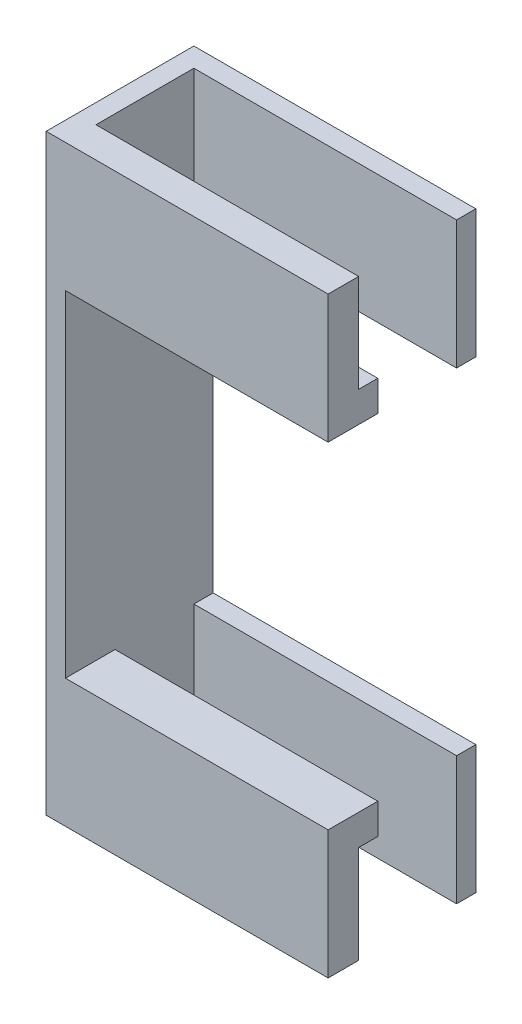
ISO-10303-21;
HEADER;
FILE_DESCRIPTION(('STEP AP214'),'2;1');
FILE_NAME('part.step','',(''),(''),'','','');
FILE_SCHEMA(('AUTOMOTIVE_DESIGN { 1 0 10303 214 1 1 1 1 }'));
ENDSEC;
DATA;
#1=APPLICATION_CONTEXT('core data for automotive mechanical design processes');
#2=APPLICATION_PROTOCOL_DEFINITION('international standard','automotive_design',2000,#1);
#3=PRODUCT_CONTEXT('',#1,'mechanical');
#4=PRODUCT('Part','Part','',(#3));
#5=PRODUCT_RELATED_PRODUCT_CATEGORY('part','',(#4));
#6=PRODUCT_DEFINITION_FORMATION('','',#4);
#7=PRODUCT_DEFINITION_CONTEXT('part definition',#1,'design');
#8=PRODUCT_DEFINITION('design','',#6,#7);
#9=PRODUCT_DEFINITION_SHAPE('','',#8);
#10=(LENGTH_UNIT() NAMED_UNIT(*) SI_UNIT(.MILLI.,.METRE.));
#11=(NAMED_UNIT(*) PLANE_ANGLE_UNIT() SI_UNIT($,.RADIAN.));
#12=(NAMED_UNIT(*) SI_UNIT($,.STERADIAN.) SOLID_ANGLE_UNIT());
#13=UNCERTAINTY_MEASURE_WITH_UNIT(LENGTH_MEASURE(1.E-05),#10,'distance_accuracy_value','');
#14=(GEOMETRIC_REPRESENTATION_CONTEXT(3) GLOBAL_UNCERTAINTY_ASSIGNED_CONTEXT((#13)) GLOBAL_UNIT_ASSIGNED_CONTEXT((#10,
#11,#12)) REPRESENTATION_CONTEXT('',''));
#15=CARTESIAN_POINT('',(0.,0.,0.));
#16=DIRECTION('',(0.,0.,1.));
#17=DIRECTION('',(1.,0.,0.));
#18=AXIS2_PLACEMENT_3D('',#15,#16,#17);
#19=CARTESIAN_POINT('',(0.,0.,-0.1397));
#20=DIRECTION('',(0.,0.,-1.));
#21=DIRECTION('',(-1.,0.,0.));
#22=AXIS2_PLACEMENT_3D('',#19,#20,#21);
#23=PLANE('',#22);
#24=DIRECTION('',(0.,-1.,0.));
#25=VECTOR('',#24,1.);
#26=CARTESIAN_POINT('',(21.844,19.8501,-0.1397));
#27=LINE('',#26,#25);
#28=CARTESIAN_POINT('',(21.844,-13.9573,-0.1397));
#29=VERTEX_POINT('',#28);
#30=CARTESIAN_POINT('',(21.844,-24.6253,-0.1397));
#31=VERTEX_POINT('',#30);
#32=EDGE_CURVE('E218',#29,#31,#27,.T.);
#33=ORIENTED_EDGE('',*,*,#32,.F.);
#34=DIRECTION('',(1.,0.,0.));
#35=VECTOR('',#34,1.);
#36=CARTESIAN_POINT('',(21.844,-13.9573,-0.1397));
#37=LINE('',#36,#35);
#38=CARTESIAN_POINT('',(0.,-13.9573,-0.1397));
#39=VERTEX_POINT('',#38);
#40=EDGE_CURVE('E162',#39,#29,#37,.T.);
#41=ORIENTED_EDGE('',*,*,#40,.F.);
#42=DIRECTION('',(0.,-1.,0.));
#43=VECTOR('',#42,1.);
#44=CARTESIAN_POINT('',(0.,19.8501,-0.1397));
#45=LINE('',#44,#43);
#46=CARTESIAN_POINT('',(0.,-24.6253,-0.1397));
#47=VERTEX_POINT('',#46);
#48=EDGE_CURVE('E224',#39,#47,#45,.T.);
#49=ORIENTED_EDGE('',*,*,#48,.T.);
#50=DIRECTION('',(1.,0.,0.));
#51=VECTOR('',#50,1.);
#52=CARTESIAN_POINT('',(0.,-24.6253,-0.1397));
#53=LINE('',#52,#51);
#54=EDGE_CURVE('E186',#47,#31,#53,.T.);
#55=ORIENTED_EDGE('',*,*,#54,.T.);
#56=EDGE_LOOP('',(#33,#41,#49,#55));
#57=FACE_BOUND('',#56,.T.);
#58=ADVANCED_FACE('F33',(#57),#23,.F.);
#59=CARTESIAN_POINT('',(21.844,19.8501,-1.7399));
#60=DIRECTION('',(-1.,0.,0.));
#61=DIRECTION('',(0.,0.,1.));
#62=AXIS2_PLACEMENT_3D('',#59,#60,#61);
#63=PLANE('',#62);
#64=DIRECTION('',(0.,-1.,0.));
#65=VECTOR('',#64,1.);
#66=CARTESIAN_POINT('',(21.844,19.8501,-1.7399));
#67=LINE('',#66,#65);
#68=CARTESIAN_POINT('',(21.844,-13.9573,-1.7399));
#69=VERTEX_POINT('',#68);
#70=CARTESIAN_POINT('',(21.844,-24.6253,-1.7399));
#71=VERTEX_POINT('',#70);
#72=EDGE_CURVE('E221',#69,#71,#67,.T.);
#73=ORIENTED_EDGE('',*,*,#72,.F.);
#74=DIRECTION('',(0.,0.,1.));
#75=VECTOR('',#74,1.);
#76=CARTESIAN_POINT('',(21.844,-13.9573,-6.4897));
#77=LINE('',#76,#75);
#78=EDGE_CURVE('E174',#69,#29,#77,.T.);
#79=ORIENTED_EDGE('',*,*,#78,.T.);
#80=ORIENTED_EDGE('',*,*,#32,.T.);
#81=DIRECTION('',(0.,0.,-1.));
#82=VECTOR('',#81,1.);
#83=CARTESIAN_POINT('',(21.844,-24.6253,-0.1397));
#84=LINE('',#83,#82);
#85=EDGE_CURVE('E183',#31,#71,#84,.T.);
#86=ORIENTED_EDGE('',*,*,#85,.T.);
#87=EDGE_LOOP('',(#73,#79,#80,#86));
#88=FACE_BOUND('',#87,.T.);
#89=ADVANCED_FACE('F369',(#88),#63,.F.);
#90=CARTESIAN_POINT('',(21.844,16.4973,6.4135));
#91=DIRECTION('',(0.,0.,1.));
#92=DIRECTION('',(1.,0.,0.));
#93=AXIS2_PLACEMENT_3D('',#90,#91,#92);
#94=PLANE('',#93);
#95=DIRECTION('',(0.,-1.,0.));
#96=VECTOR('',#95,1.);
#97=CARTESIAN_POINT('',(0.,19.8501,6.4135));
#98=LINE('',#97,#96);
#99=CARTESIAN_POINT('',(0.,16.4973,6.4135));
#100=VERTEX_POINT('',#99);
#101=CARTESIAN_POINT('',(0.,13.9573,6.4135));
#102=VERTEX_POINT('',#101);
#103=EDGE_CURVE('E127',#100,#102,#98,.T.);
#104=ORIENTED_EDGE('',*,*,#103,.F.);
#105=DIRECTION('',(-1.,0.,0.));
#106=VECTOR('',#105,1.);
#107=CARTESIAN_POINT('',(21.844,16.4973,6.4135));
#108=LINE('',#107,#106);
#109=CARTESIAN_POINT('',(21.844,16.4973,6.4135));
#110=VERTEX_POINT('',#109);
#111=EDGE_CURVE('E105',#110,#100,#108,.T.);
#112=ORIENTED_EDGE('',*,*,#111,.F.);
#113=DIRECTION('',(0.,1.,0.));
#114=VECTOR('',#113,1.);
#115=CARTESIAN_POINT('',(21.844,16.4973,6.4135));
#116=LINE('',#115,#114);
#117=CARTESIAN_POINT('',(21.844,13.9573,6.4135));
#118=VERTEX_POINT('',#117);
#119=EDGE_CURVE('E92',#118,#110,#116,.T.);
#120=ORIENTED_EDGE('',*,*,#119,.F.);
#121=DIRECTION('',(-1.,0.,0.));
#122=VECTOR('',#121,1.);
#123=CARTESIAN_POINT('',(21.844,13.9573,6.4135));
#124=LINE('',#123,#122);
#125=EDGE_CURVE('E99',#118,#102,#124,.T.);
#126=ORIENTED_EDGE('',*,*,#125,.T.);
#127=EDGE_LOOP('',(#104,#112,#120,#126));
#128=FACE_BOUND('',#127,.T.);
#129=ADVANCED_FACE('F107',(#128),#94,.F.);
#130=CARTESIAN_POINT('',(0.,-13.9573,6.4135));
#131=VERTEX_POINT('',#130);
#132=CARTESIAN_POINT('',(0.,-16.4973,6.4135));
#133=VERTEX_POINT('',#132);
#134=EDGE_CURVE('E125',#131,#133,#98,.T.);
#135=ORIENTED_EDGE('',*,*,#134,.F.);
#136=DIRECTION('',(-1.,0.,0.));
#137=VECTOR('',#136,1.);
#138=CARTESIAN_POINT('',(21.844,-13.9573,6.4135));
#139=LINE('',#138,#137);
#140=CARTESIAN_POINT('',(21.844,-13.9573,6.4135));
#141=VERTEX_POINT('',#140);
#142=EDGE_CURVE('E257',#141,#131,#139,.T.);
#143=ORIENTED_EDGE('',*,*,#142,.F.);
#144=DIRECTION('',(0.,1.,0.));
#145=VECTOR('',#144,1.);
#146=CARTESIAN_POINT('',(21.844,-16.4973,6.4135));
#147=LINE('',#146,#145);
#148=CARTESIAN_POINT('',(21.844,-16.4973,6.4135));
#149=VERTEX_POINT('',#148);
#150=EDGE_CURVE('E238',#149,#141,#147,.T.);
#151=ORIENTED_EDGE('',*,*,#150,.F.);
#152=DIRECTION('',(-1.,0.,0.));
#153=VECTOR('',#152,1.);
#154=CARTESIAN_POINT('',(21.844,-16.4973,6.4135));
#155=LINE('',#154,#153);
#156=EDGE_CURVE('E260',#149,#133,#155,.T.);
#157=ORIENTED_EDGE('',*,*,#156,.T.);
#158=EDGE_LOOP('',(#135,#143,#151,#157));
#159=FACE_BOUND('',#158,.T.);
#160=ADVANCED_FACE('F445',(#159),#94,.F.);
#161=CARTESIAN_POINT('',(21.844,19.8501,10.541));
#162=DIRECTION('',(0.,0.,-1.));
#163=DIRECTION('',(-1.,0.,0.));
#164=AXIS2_PLACEMENT_3D('',#161,#162,#163);
#165=PLANE('',#164);
#166=DIRECTION('',(0.,-1.,0.));
#167=VECTOR('',#166,1.);
#168=CARTESIAN_POINT('',(21.844,19.8501,10.541));
#169=LINE('',#168,#167);
#170=CARTESIAN_POINT('',(21.844,24.6253,10.541));
#171=VERTEX_POINT('',#170);
#172=CARTESIAN_POINT('',(21.844,13.9573,10.541));
#173=VERTEX_POINT('',#172);
#174=EDGE_CURVE('E96',#171,#173,#169,.T.);
#175=ORIENTED_EDGE('',*,*,#174,.F.);
#176=DIRECTION('',(1.,0.,0.));
#177=VECTOR('',#176,1.);
#178=CARTESIAN_POINT('',(-1.6002,24.6253,10.541));
#179=LINE('',#178,#177);
#180=CARTESIAN_POINT('',(-1.6002,24.6253,10.541));
#181=VERTEX_POINT('',#180);
#182=EDGE_CURVE('E215',#181,#171,#179,.T.);
#183=ORIENTED_EDGE('',*,*,#182,.F.);
#184=DIRECTION('',(0.,1.,0.));
#185=VECTOR('',#184,1.);
#186=CARTESIAN_POINT('',(-1.6002,19.8501,10.541));
#187=LINE('',#186,#185);
#188=CARTESIAN_POINT('',(-1.6002,-24.6253,10.541));
#189=VERTEX_POINT('',#188);
#190=EDGE_CURVE('E118',#189,#181,#187,.T.);
#191=ORIENTED_EDGE('',*,*,#190,.F.);
#192=DIRECTION('',(1.,0.,0.));
#193=VECTOR('',#192,1.);
#194=CARTESIAN_POINT('',(-1.6002,-24.6253,10.541));
#195=LINE('',#194,#193);
#196=CARTESIAN_POINT('',(21.844,-24.6253,10.541));
#197=VERTEX_POINT('',#196);
#198=EDGE_CURVE('E173',#189,#197,#195,.T.);
#199=ORIENTED_EDGE('',*,*,#198,.T.);
#200=DIRECTION('',(0.,-1.,0.));
#201=VECTOR('',#200,1.);
#202=CARTESIAN_POINT('',(21.844,-19.8501,10.541));
#203=LINE('',#202,#201);
#204=CARTESIAN_POINT('',(21.844,-13.9573,10.541));
#205=VERTEX_POINT('',#204);
#206=EDGE_CURVE('E244',#205,#197,#203,.T.);
#207=ORIENTED_EDGE('',*,*,#206,.F.);
#208=DIRECTION('',(-1.,0.,0.));
#209=VECTOR('',#208,1.);
#210=CARTESIAN_POINT('',(21.844,-13.9573,10.541));
#211=LINE('',#210,#209);
#212=CARTESIAN_POINT('',(0.,-13.9573,10.541));
#213=VERTEX_POINT('',#212);
#214=EDGE_CURVE('E247',#205,#213,#211,.T.);
#215=ORIENTED_EDGE('',*,*,#214,.T.);
#216=DIRECTION('',(0.,1.,0.));
#217=VECTOR('',#216,1.);
#218=CARTESIAN_POINT('',(0.,19.8501,10.541));
#219=LINE('',#218,#217);
#220=CARTESIAN_POINT('',(0.,13.9573,10.541));
#221=VERTEX_POINT('',#220);
#222=EDGE_CURVE('E266',#213,#221,#219,.T.);
#223=ORIENTED_EDGE('',*,*,#222,.T.);
#224=DIRECTION('',(-1.,0.,0.));
#225=VECTOR('',#224,1.);
#226=CARTESIAN_POINT('',(21.844,13.9573,10.541));
#227=LINE('',#226,#225);
#228=EDGE_CURVE('E104',#173,#221,#227,.T.);
#229=ORIENTED_EDGE('',*,*,#228,.F.);
#230=EDGE_LOOP('',(#175,#183,#191,#199,#207,#215,#223,#229));
#231=FACE_BOUND('',#230,.T.);
#232=ADVANCED_FACE('F35',(#231),#165,.F.);
#233=CARTESIAN_POINT('',(21.844,13.9573,10.541));
#234=DIRECTION('',(0.,1.,0.));
#235=DIRECTION('',(0.,0.,1.));
#236=AXIS2_PLACEMENT_3D('',#233,#234,#235);
#237=PLANE('',#236);
#238=DIRECTION('',(0.,0.,-1.));
#239=VECTOR('',#238,1.);
#240=CARTESIAN_POINT('',(0.,13.9573,10.541));
#241=LINE('',#240,#239);
#242=EDGE_CURVE('E70',#221,#102,#241,.T.);
#243=ORIENTED_EDGE('',*,*,#242,.T.);
#244=ORIENTED_EDGE('',*,*,#125,.F.);
#245=DIRECTION('',(0.,0.,-1.));
#246=VECTOR('',#245,1.);
#247=CARTESIAN_POINT('',(21.844,13.9573,10.541));
#248=LINE('',#247,#246);
#249=EDGE_CURVE('E89',#173,#118,#248,.T.);
#250=ORIENTED_EDGE('',*,*,#249,.F.);
#251=ORIENTED_EDGE('',*,*,#228,.T.);
#252=EDGE_LOOP('',(#243,#244,#250,#251));
#253=FACE_BOUND('',#252,.T.);
#254=ADVANCED_FACE('F100',(#253),#237,.F.);
#255=CARTESIAN_POINT('',(21.844,16.4973,8.001));
#256=DIRECTION('',(0.,-1.,0.));
#257=DIRECTION('',(0.,0.,-1.));
#258=AXIS2_PLACEMENT_3D('',#255,#256,#257);
#259=PLANE('',#258);
#260=DIRECTION('',(0.,0.,1.));
#261=VECTOR('',#260,1.);
#262=CARTESIAN_POINT('',(0.,16.4973,8.001));
#263=LINE('',#262,#261);
#264=CARTESIAN_POINT('',(0.,16.4973,8.001));
#265=VERTEX_POINT('',#264);
#266=EDGE_CURVE('E117',#100,#265,#263,.T.);
#267=ORIENTED_EDGE('',*,*,#266,.T.);
#268=DIRECTION('',(-1.,0.,0.));
#269=VECTOR('',#268,1.);
#270=CARTESIAN_POINT('',(21.844,16.4973,8.001));
#271=LINE('',#270,#269);
#272=CARTESIAN_POINT('',(21.844,16.4973,8.001));
#273=VERTEX_POINT('',#272);
#274=EDGE_CURVE('E115',#273,#265,#271,.T.);
#275=ORIENTED_EDGE('',*,*,#274,.F.);
#276=DIRECTION('',(0.,0.,1.));
#277=VECTOR('',#276,1.);
#278=CARTESIAN_POINT('',(21.844,16.4973,8.001));
#279=LINE('',#278,#277);
#280=EDGE_CURVE('E57',#110,#273,#279,.T.);
#281=ORIENTED_EDGE('',*,*,#280,.F.);
#282=ORIENTED_EDGE('',*,*,#111,.T.);
#283=EDGE_LOOP('',(#267,#275,#281,#282));
#284=FACE_BOUND('',#283,.T.);
#285=ADVANCED_FACE('F380',(#284),#259,.F.);
#286=CARTESIAN_POINT('',(21.844,19.8501,8.001));
#287=DIRECTION('',(0.,0.,1.));
#288=DIRECTION('',(1.,0.,0.));
#289=AXIS2_PLACEMENT_3D('',#286,#287,#288);
#290=PLANE('',#289);
#291=DIRECTION('',(0.,1.,0.));
#292=VECTOR('',#291,1.);
#293=CARTESIAN_POINT('',(0.,19.8501,8.001));
#294=LINE('',#293,#292);
#295=CARTESIAN_POINT('',(0.,24.6253,8.001));
#296=VERTEX_POINT('',#295);
#297=EDGE_CURVE('E81',#265,#296,#294,.T.);
#298=ORIENTED_EDGE('',*,*,#297,.T.);
#299=DIRECTION('',(-1.,0.,0.));
#300=VECTOR('',#299,1.);
#301=CARTESIAN_POINT('',(21.844,24.6253,8.001));
#302=LINE('',#301,#300);
#303=CARTESIAN_POINT('',(21.844,24.6253,8.001));
#304=VERTEX_POINT('',#303);
#305=EDGE_CURVE('E198',#304,#296,#302,.T.);
#306=ORIENTED_EDGE('',*,*,#305,.F.);
#307=DIRECTION('',(0.,1.,0.));
#308=VECTOR('',#307,1.);
#309=CARTESIAN_POINT('',(21.844,19.8501,8.001));
#310=LINE('',#309,#308);
#311=EDGE_CURVE('E110',#273,#304,#310,.T.);
#312=ORIENTED_EDGE('',*,*,#311,.F.);
#313=ORIENTED_EDGE('',*,*,#274,.T.);
#314=EDGE_LOOP('',(#298,#306,#312,#313));
#315=FACE_BOUND('',#314,.T.);
#316=ADVANCED_FACE('F378',(#315),#290,.F.);
#317=CARTESIAN_POINT('',(21.844,0.,0.));
#318=DIRECTION('',(-1.,0.,0.));
#319=DIRECTION('',(0.,0.,1.));
#320=AXIS2_PLACEMENT_3D('',#317,#318,#319);
#321=PLANE('',#320);
#322=ORIENTED_EDGE('',*,*,#311,.T.);
#323=DIRECTION('',(0.,0.,-1.));
#324=VECTOR('',#323,1.);
#325=CARTESIAN_POINT('',(21.844,24.6253,10.541));
#326=LINE('',#325,#324);
#327=EDGE_CURVE('E195',#171,#304,#326,.T.);
#328=ORIENTED_EDGE('',*,*,#327,.F.);
#329=ORIENTED_EDGE('',*,*,#174,.T.);
#330=ORIENTED_EDGE('',*,*,#249,.T.);
#331=ORIENTED_EDGE('',*,*,#119,.T.);
#332=ORIENTED_EDGE('',*,*,#280,.T.);
#333=EDGE_LOOP('',(#322,#328,#329,#330,#331,#332));
#334=FACE_BOUND('',#333,.T.);
#335=ADVANCED_FACE('F90',(#334),#321,.F.);
#336=CARTESIAN_POINT('',(0.,0.,0.));
#337=DIRECTION('',(-1.,0.,0.));
#338=DIRECTION('',(0.,0.,1.));
#339=AXIS2_PLACEMENT_3D('',#336,#337,#338);
#340=PLANE('',#339);
#341=ORIENTED_EDGE('',*,*,#297,.F.);
#342=ORIENTED_EDGE('',*,*,#266,.F.);
#343=ORIENTED_EDGE('',*,*,#103,.T.);
#344=ORIENTED_EDGE('',*,*,#242,.F.);
#345=ORIENTED_EDGE('',*,*,#222,.F.);
#346=DIRECTION('',(0.,0.,1.));
#347=VECTOR('',#346,1.);
#348=CARTESIAN_POINT('',(0.,-13.9573,10.541));
#349=LINE('',#348,#347);
#350=EDGE_CURVE('E235',#131,#213,#349,.T.);
#351=ORIENTED_EDGE('',*,*,#350,.F.);
#352=ORIENTED_EDGE('',*,*,#134,.T.);
#353=DIRECTION('',(0.,0.,-1.));
#354=VECTOR('',#353,1.);
#355=CARTESIAN_POINT('',(0.,-16.4973,8.001));
#356=LINE('',#355,#354);
#357=CARTESIAN_POINT('',(0.,-16.4973,8.001));
#358=VERTEX_POINT('',#357);
#359=EDGE_CURVE('E250',#358,#133,#356,.T.);
#360=ORIENTED_EDGE('',*,*,#359,.F.);
#361=DIRECTION('',(0.,1.,0.));
#362=VECTOR('',#361,1.);
#363=CARTESIAN_POINT('',(0.,-19.8501,8.001));
#364=LINE('',#363,#362);
#365=CARTESIAN_POINT('',(0.,-24.6253,8.001));
#366=VERTEX_POINT('',#365);
#367=EDGE_CURVE('E229',#366,#358,#364,.T.);
#368=ORIENTED_EDGE('',*,*,#367,.F.);
#369=DIRECTION('',(0.,0.,-1.));
#370=VECTOR('',#369,1.);
#371=CARTESIAN_POINT('',(0.,-24.6253,8.001));
#372=LINE('',#371,#370);
#373=EDGE_CURVE('E189',#366,#47,#372,.T.);
#374=ORIENTED_EDGE('',*,*,#373,.T.);
#375=ORIENTED_EDGE('',*,*,#48,.F.);
#376=DIRECTION('',(0.,0.,1.));
#377=VECTOR('',#376,1.);
#378=CARTESIAN_POINT('',(0.,-13.9573,-6.4897));
#379=LINE('',#378,#377);
#380=CARTESIAN_POINT('',(0.,-13.9573,-1.7399));
#381=VERTEX_POINT('',#380);
#382=EDGE_CURVE('E137',#381,#39,#379,.T.);
#383=ORIENTED_EDGE('',*,*,#382,.F.);
#384=DIRECTION('',(0.,1.,0.));
#385=VECTOR('',#384,1.);
#386=CARTESIAN_POINT('',(0.,0.,-1.7399));
#387=LINE('',#386,#385);
#388=CARTESIAN_POINT('',(0.,13.9573,-1.7399));
#389=VERTEX_POINT('',#388);
#390=EDGE_CURVE('E41',#381,#389,#387,.T.);
#391=ORIENTED_EDGE('',*,*,#390,.T.);
#392=DIRECTION('',(0.,0.,1.));
#393=VECTOR('',#392,1.);
#394=CARTESIAN_POINT('',(0.,13.9573,-6.4897));
#395=LINE('',#394,#393);
#396=CARTESIAN_POINT('',(0.,13.9573,-0.1397));
#397=VERTEX_POINT('',#396);
#398=EDGE_CURVE('E48',#389,#397,#395,.T.);
#399=ORIENTED_EDGE('',*,*,#398,.T.);
#400=CARTESIAN_POINT('',(0.,24.6253,-0.1397));
#401=VERTEX_POINT('',#400);
#402=EDGE_CURVE('E226',#401,#397,#45,.T.);
#403=ORIENTED_EDGE('',*,*,#402,.F.);
#404=DIRECTION('',(0.,0.,-1.));
#405=VECTOR('',#404,1.);
#406=CARTESIAN_POINT('',(0.,24.6253,8.001));
#407=LINE('',#406,#405);
#408=EDGE_CURVE('E201',#296,#401,#407,.T.);
#409=ORIENTED_EDGE('',*,*,#408,.F.);
#410=EDGE_LOOP('',(#341,#342,#343,#344,#345,#351,#352,#360,#368,#374,#375,#383,#391,#399,#403,#409));
#411=FACE_BOUND('',#410,.T.);
#412=ADVANCED_FACE('F131',(#411),#340,.F.);
#413=CARTESIAN_POINT('',(-1.6002,0.,0.));
#414=DIRECTION('',(-1.,0.,0.));
#415=DIRECTION('',(0.,0.,1.));
#416=AXIS2_PLACEMENT_3D('',#413,#414,#415);
#417=PLANE('',#416);
#418=ORIENTED_EDGE('',*,*,#190,.T.);
#419=DIRECTION('',(0.,0.,1.));
#420=VECTOR('',#419,1.);
#421=CARTESIAN_POINT('',(-1.6002,24.6253,-1.7399));
#422=LINE('',#421,#420);
#423=CARTESIAN_POINT('',(-1.6002,24.6253,-1.7399));
#424=VERTEX_POINT('',#423);
#425=EDGE_CURVE('E212',#424,#181,#422,.T.);
#426=ORIENTED_EDGE('',*,*,#425,.F.);
#427=DIRECTION('',(0.,1.,0.));
#428=VECTOR('',#427,1.);
#429=CARTESIAN_POINT('',(-1.6002,19.8501,-1.7399));
#430=LINE('',#429,#428);
#431=CARTESIAN_POINT('',(-1.6002,-24.6253,-1.7399));
#432=VERTEX_POINT('',#431);
#433=EDGE_CURVE('E220',#432,#424,#430,.T.);
#434=ORIENTED_EDGE('',*,*,#433,.F.);
#435=DIRECTION('',(0.,0.,1.));
#436=VECTOR('',#435,1.);
#437=CARTESIAN_POINT('',(-1.6002,-24.6253,-1.7399));
#438=LINE('',#437,#436);
#439=EDGE_CURVE('E177',#432,#189,#438,.T.);
#440=ORIENTED_EDGE('',*,*,#439,.T.);
#441=EDGE_LOOP('',(#418,#426,#434,#440));
#442=FACE_BOUND('',#441,.T.);
#443=ADVANCED_FACE('F363',(#442),#417,.T.);
#444=CARTESIAN_POINT('',(21.844,-19.8501,8.001));
#445=DIRECTION('',(0.,0.,1.));
#446=DIRECTION('',(1.,0.,0.));
#447=AXIS2_PLACEMENT_3D('',#444,#445,#446);
#448=PLANE('',#447);
#449=ORIENTED_EDGE('',*,*,#367,.T.);
#450=DIRECTION('',(-1.,0.,0.));
#451=VECTOR('',#450,1.);
#452=CARTESIAN_POINT('',(21.844,-16.4973,8.001));
#453=LINE('',#452,#451);
#454=CARTESIAN_POINT('',(21.844,-16.4973,8.001));
#455=VERTEX_POINT('',#454);
#456=EDGE_CURVE('E263',#455,#358,#453,.T.);
#457=ORIENTED_EDGE('',*,*,#456,.F.);
#458=DIRECTION('',(0.,1.,0.));
#459=VECTOR('',#458,1.);
#460=CARTESIAN_POINT('',(21.844,-19.8501,8.001));
#461=LINE('',#460,#459);
#462=CARTESIAN_POINT('',(21.844,-24.6253,8.001));
#463=VERTEX_POINT('',#462);
#464=EDGE_CURVE('E231',#463,#455,#461,.T.);
#465=ORIENTED_EDGE('',*,*,#464,.F.);
#466=DIRECTION('',(-1.,0.,0.));
#467=VECTOR('',#466,1.);
#468=CARTESIAN_POINT('',(21.844,-24.6253,8.001));
#469=LINE('',#468,#467);
#470=EDGE_CURVE('E192',#463,#366,#469,.T.);
#471=ORIENTED_EDGE('',*,*,#470,.T.);
#472=EDGE_LOOP('',(#449,#457,#465,#471));
#473=FACE_BOUND('',#472,.T.);
#474=ADVANCED_FACE('F354',(#473),#448,.F.);
#475=CARTESIAN_POINT('',(21.844,-16.4973,8.001));
#476=DIRECTION('',(0.,1.,0.));
#477=DIRECTION('',(0.,0.,1.));
#478=AXIS2_PLACEMENT_3D('',#475,#476,#477);
#479=PLANE('',#478);
#480=ORIENTED_EDGE('',*,*,#359,.T.);
#481=ORIENTED_EDGE('',*,*,#156,.F.);
#482=DIRECTION('',(0.,0.,-1.));
#483=VECTOR('',#482,1.);
#484=CARTESIAN_POINT('',(21.844,-16.4973,8.001));
#485=LINE('',#484,#483);
#486=EDGE_CURVE('E234',#455,#149,#485,.T.);
#487=ORIENTED_EDGE('',*,*,#486,.F.);
#488=ORIENTED_EDGE('',*,*,#456,.T.);
#489=EDGE_LOOP('',(#480,#481,#487,#488));
#490=FACE_BOUND('',#489,.T.);
#491=ADVANCED_FACE('F409',(#490),#479,.F.);
#492=CARTESIAN_POINT('',(21.844,-13.9573,10.541));
#493=DIRECTION('',(0.,-1.,0.));
#494=DIRECTION('',(0.,0.,-1.));
#495=AXIS2_PLACEMENT_3D('',#492,#493,#494);
#496=PLANE('',#495);
#497=ORIENTED_EDGE('',*,*,#350,.T.);
#498=ORIENTED_EDGE('',*,*,#214,.F.);
#499=DIRECTION('',(0.,0.,1.));
#500=VECTOR('',#499,1.);
#501=CARTESIAN_POINT('',(21.844,-13.9573,10.541));
#502=LINE('',#501,#500);
#503=EDGE_CURVE('E241',#141,#205,#502,.T.);
#504=ORIENTED_EDGE('',*,*,#503,.F.);
#505=ORIENTED_EDGE('',*,*,#142,.T.);
#506=EDGE_LOOP('',(#497,#498,#504,#505));
#507=FACE_BOUND('',#506,.T.);
#508=ADVANCED_FACE('F403',(#507),#496,.F.);
#509=CARTESIAN_POINT('',(21.844,0.,0.));
#510=DIRECTION('',(-1.,0.,0.));
#511=DIRECTION('',(0.,0.,1.));
#512=AXIS2_PLACEMENT_3D('',#509,#510,#511);
#513=PLANE('',#512);
#514=ORIENTED_EDGE('',*,*,#464,.T.);
#515=ORIENTED_EDGE('',*,*,#486,.T.);
#516=ORIENTED_EDGE('',*,*,#150,.T.);
#517=ORIENTED_EDGE('',*,*,#503,.T.);
#518=ORIENTED_EDGE('',*,*,#206,.T.);
#519=DIRECTION('',(0.,0.,-1.));
#520=VECTOR('',#519,1.);
#521=CARTESIAN_POINT('',(21.844,-24.6253,10.541));
#522=LINE('',#521,#520);
#523=EDGE_CURVE('E170',#197,#463,#522,.T.);
#524=ORIENTED_EDGE('',*,*,#523,.T.);
#525=EDGE_LOOP('',(#514,#515,#516,#517,#518,#524));
#526=FACE_BOUND('',#525,.T.);
#527=ADVANCED_FACE('F357',(#526),#513,.F.);
#528=ORIENTED_EDGE('',*,*,#402,.T.);
#529=DIRECTION('',(-1.,0.,0.));
#530=VECTOR('',#529,1.);
#531=CARTESIAN_POINT('',(21.844,13.9573,-0.1397));
#532=LINE('',#531,#530);
#533=CARTESIAN_POINT('',(21.844,13.9573,-0.1397));
#534=VERTEX_POINT('',#533);
#535=EDGE_CURVE('E166',#534,#397,#532,.T.);
#536=ORIENTED_EDGE('',*,*,#535,.F.);
#537=CARTESIAN_POINT('',(21.844,24.6253,-0.1397));
#538=VERTEX_POINT('',#537);
#539=EDGE_CURVE('E161',#538,#534,#27,.T.);
#540=ORIENTED_EDGE('',*,*,#539,.F.);
#541=DIRECTION('',(1.,0.,0.));
#542=VECTOR('',#541,1.);
#543=CARTESIAN_POINT('',(0.,24.6253,-0.1397));
#544=LINE('',#543,#542);
#545=EDGE_CURVE('E204',#401,#538,#544,.T.);
#546=ORIENTED_EDGE('',*,*,#545,.F.);
#547=EDGE_LOOP('',(#528,#536,#540,#546));
#548=FACE_BOUND('',#547,.T.);
#549=ADVANCED_FACE('F374',(#548),#23,.F.);
#550=ORIENTED_EDGE('',*,*,#539,.T.);
#551=DIRECTION('',(0.,0.,1.));
#552=VECTOR('',#551,1.);
#553=CARTESIAN_POINT('',(21.844,13.9573,-6.4897));
#554=LINE('',#553,#552);
#555=CARTESIAN_POINT('',(21.844,13.9573,-1.7399));
#556=VERTEX_POINT('',#555);
#557=EDGE_CURVE('E150',#556,#534,#554,.T.);
#558=ORIENTED_EDGE('',*,*,#557,.F.);
#559=CARTESIAN_POINT('',(21.844,24.6253,-1.7399));
#560=VERTEX_POINT('',#559);
#561=EDGE_CURVE('E145',#560,#556,#67,.T.);
#562=ORIENTED_EDGE('',*,*,#561,.F.);
#563=DIRECTION('',(0.,0.,-1.));
#564=VECTOR('',#563,1.);
#565=CARTESIAN_POINT('',(21.844,24.6253,-0.1397));
#566=LINE('',#565,#564);
#567=EDGE_CURVE('E207',#538,#560,#566,.T.);
#568=ORIENTED_EDGE('',*,*,#567,.F.);
#569=EDGE_LOOP('',(#550,#558,#562,#568));
#570=FACE_BOUND('',#569,.T.);
#571=ADVANCED_FACE('F156',(#570),#63,.F.);
#572=CARTESIAN_POINT('',(0.,0.,-1.7399));
#573=DIRECTION('',(0.,0.,-1.));
#574=DIRECTION('',(-1.,0.,0.));
#575=AXIS2_PLACEMENT_3D('',#572,#573,#574);
#576=PLANE('',#575);
#577=DIRECTION('',(-1.,0.,0.));
#578=VECTOR('',#577,1.);
#579=CARTESIAN_POINT('',(0.,-13.9573,-1.7399));
#580=LINE('',#579,#578);
#581=EDGE_CURVE('E11',#69,#381,#580,.T.);
#582=ORIENTED_EDGE('',*,*,#581,.F.);
#583=ORIENTED_EDGE('',*,*,#72,.T.);
#584=DIRECTION('',(-1.,0.,0.));
#585=VECTOR('',#584,1.);
#586=CARTESIAN_POINT('',(21.844,-24.6253,-1.7399));
#587=LINE('',#586,#585);
#588=EDGE_CURVE('E180',#71,#432,#587,.T.);
#589=ORIENTED_EDGE('',*,*,#588,.T.);
#590=ORIENTED_EDGE('',*,*,#433,.T.);
#591=DIRECTION('',(-1.,0.,0.));
#592=VECTOR('',#591,1.);
#593=CARTESIAN_POINT('',(21.844,24.6253,-1.7399));
#594=LINE('',#593,#592);
#595=EDGE_CURVE('E209',#560,#424,#594,.T.);
#596=ORIENTED_EDGE('',*,*,#595,.F.);
#597=ORIENTED_EDGE('',*,*,#561,.T.);
#598=DIRECTION('',(1.,0.,0.));
#599=VECTOR('',#598,1.);
#600=CARTESIAN_POINT('',(0.,13.9573,-1.7399));
#601=LINE('',#600,#599);
#602=EDGE_CURVE('E126',#389,#556,#601,.T.);
#603=ORIENTED_EDGE('',*,*,#602,.F.);
#604=ORIENTED_EDGE('',*,*,#390,.F.);
#605=EDGE_LOOP('',(#582,#583,#589,#590,#596,#597,#603,#604));
#606=FACE_BOUND('',#605,.T.);
#607=ADVANCED_FACE('F141',(#606),#576,.T.);
#608=CARTESIAN_POINT('',(0.,24.6253,0.));
#609=DIRECTION('',(0.,1.,0.));
#610=DIRECTION('',(0.,0.,1.));
#611=AXIS2_PLACEMENT_3D('',#608,#609,#610);
#612=PLANE('',#611);
#613=ORIENTED_EDGE('',*,*,#327,.T.);
#614=ORIENTED_EDGE('',*,*,#305,.T.);
#615=ORIENTED_EDGE('',*,*,#408,.T.);
#616=ORIENTED_EDGE('',*,*,#545,.T.);
#617=ORIENTED_EDGE('',*,*,#567,.T.);
#618=ORIENTED_EDGE('',*,*,#595,.T.);
#619=ORIENTED_EDGE('',*,*,#425,.T.);
#620=ORIENTED_EDGE('',*,*,#182,.T.);
#621=EDGE_LOOP('',(#613,#614,#615,#616,#617,#618,#619,#620));
#622=FACE_BOUND('',#621,.T.);
#623=ADVANCED_FACE('F365',(#622),#612,.T.);
#624=CARTESIAN_POINT('',(0.,-24.6253,0.));
#625=DIRECTION('',(0.,-1.,0.));
#626=DIRECTION('',(0.,0.,1.));
#627=AXIS2_PLACEMENT_3D('',#624,#625,#626);
#628=PLANE('',#627);
#629=ORIENTED_EDGE('',*,*,#523,.F.);
#630=ORIENTED_EDGE('',*,*,#198,.F.);
#631=ORIENTED_EDGE('',*,*,#439,.F.);
#632=ORIENTED_EDGE('',*,*,#588,.F.);
#633=ORIENTED_EDGE('',*,*,#85,.F.);
#634=ORIENTED_EDGE('',*,*,#54,.F.);
#635=ORIENTED_EDGE('',*,*,#373,.F.);
#636=ORIENTED_EDGE('',*,*,#470,.F.);
#637=EDGE_LOOP('',(#629,#630,#631,#632,#633,#634,#635,#636));
#638=FACE_BOUND('',#637,.T.);
#639=ADVANCED_FACE('F351',(#638),#628,.T.);
#640=CARTESIAN_POINT('',(21.844,-13.9573,-6.4897));
#641=DIRECTION('',(0.,-1.,0.));
#642=DIRECTION('',(0.,0.,-1.));
#643=AXIS2_PLACEMENT_3D('',#640,#641,#642);
#644=PLANE('',#643);
#645=ORIENTED_EDGE('',*,*,#581,.T.);
#646=ORIENTED_EDGE('',*,*,#382,.T.);
#647=ORIENTED_EDGE('',*,*,#40,.T.);
#648=ORIENTED_EDGE('',*,*,#78,.F.);
#649=EDGE_LOOP('',(#645,#646,#647,#648));
#650=FACE_BOUND('',#649,.T.);
#651=ADVANCED_FACE('F341',(#650),#644,.F.);
#652=CARTESIAN_POINT('',(21.844,13.9573,-6.4897));
#653=DIRECTION('',(0.,1.,0.));
#654=DIRECTION('',(0.,0.,1.));
#655=AXIS2_PLACEMENT_3D('',#652,#653,#654);
#656=PLANE('',#655);
#657=ORIENTED_EDGE('',*,*,#602,.T.);
#658=ORIENTED_EDGE('',*,*,#557,.T.);
#659=ORIENTED_EDGE('',*,*,#535,.T.);
#660=ORIENTED_EDGE('',*,*,#398,.F.);
#661=EDGE_LOOP('',(#657,#658,#659,#660));
#662=FACE_BOUND('',#661,.T.);
#663=ADVANCED_FACE('F148',(#662),#656,.F.);
#664=CLOSED_SHELL('',(#58,#89,#129,#160,#232,#254,#285,#316,#335,#412,#443,#474,#491,#508,#527,
#549,#571,#607,#623,#639,#651,#663));
#665=MANIFOLD_SOLID_BREP('B2',#664);
#666=ADVANCED_BREP_SHAPE_REPRESENTATION('',(#18,#665),#14);
#667=SHAPE_DEFINITION_REPRESENTATION(#9,#666);
ENDSEC;
END-ISO-10303-21;
